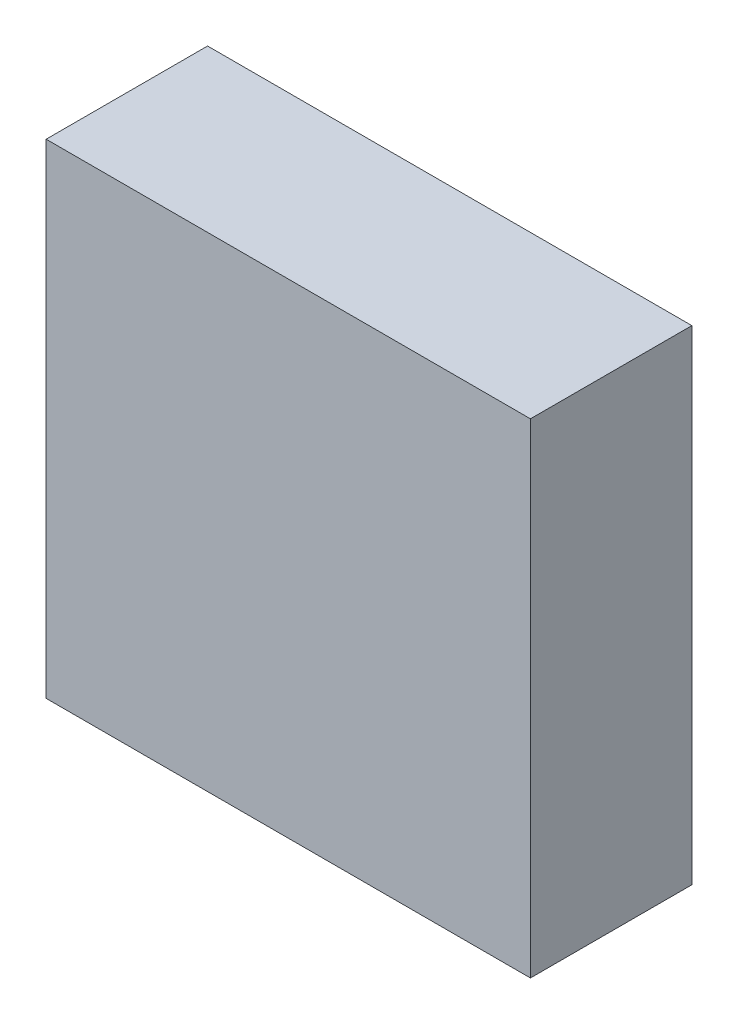
ISO-10303-21;
HEADER;
FILE_DESCRIPTION(('STEP AP214'),'2;1');
FILE_NAME('part.step','',(''),(''),'','','');
FILE_SCHEMA(('AUTOMOTIVE_DESIGN { 1 0 10303 214 1 1 1 1 }'));
ENDSEC;
DATA;
#1=APPLICATION_CONTEXT('core data for automotive mechanical design processes');
#2=APPLICATION_PROTOCOL_DEFINITION('international standard','automotive_design',2000,#1);
#3=PRODUCT_CONTEXT('',#1,'mechanical');
#4=PRODUCT('Part','Part','',(#3));
#5=PRODUCT_RELATED_PRODUCT_CATEGORY('part','',(#4));
#6=PRODUCT_DEFINITION_FORMATION('','',#4);
#7=PRODUCT_DEFINITION_CONTEXT('part definition',#1,'design');
#8=PRODUCT_DEFINITION('design','',#6,#7);
#9=PRODUCT_DEFINITION_SHAPE('','',#8);
#10=(LENGTH_UNIT() NAMED_UNIT(*) SI_UNIT(.MILLI.,.METRE.));
#11=(NAMED_UNIT(*) PLANE_ANGLE_UNIT() SI_UNIT($,.RADIAN.));
#12=(NAMED_UNIT(*) SI_UNIT($,.STERADIAN.) SOLID_ANGLE_UNIT());
#13=UNCERTAINTY_MEASURE_WITH_UNIT(LENGTH_MEASURE(1.E-05),#10,'distance_accuracy_value','');
#14=(GEOMETRIC_REPRESENTATION_CONTEXT(3) GLOBAL_UNCERTAINTY_ASSIGNED_CONTEXT((#13)) GLOBAL_UNIT_ASSIGNED_CONTEXT((#10,
#11,#12)) REPRESENTATION_CONTEXT('',''));
#15=CARTESIAN_POINT('',(0.,0.,0.));
#16=DIRECTION('',(0.,0.,1.));
#17=DIRECTION('',(1.,0.,0.));
#18=AXIS2_PLACEMENT_3D('',#15,#16,#17);
#19=CARTESIAN_POINT('',(4.7625,-4.7625,1.5875));
#20=DIRECTION('',(-1.,0.,0.));
#21=DIRECTION('',(0.,0.,1.));
#22=AXIS2_PLACEMENT_3D('',#19,#20,#21);
#23=PLANE('',#22);
#24=DIRECTION('',(0.,1.,0.));
#25=VECTOR('',#24,1.);
#26=CARTESIAN_POINT('',(4.7625,-4.7625,-1.5875));
#27=LINE('',#26,#25);
#28=CARTESIAN_POINT('',(4.7625,-4.7625,-1.5875));
#29=VERTEX_POINT('',#28);
#30=CARTESIAN_POINT('',(4.7625,4.7625,-1.5875));
#31=VERTEX_POINT('',#30);
#32=EDGE_CURVE('E97',#29,#31,#27,.T.);
#33=ORIENTED_EDGE('',*,*,#32,.T.);
#34=DIRECTION('',(0.,0.,-1.));
#35=VECTOR('',#34,1.);
#36=CARTESIAN_POINT('',(4.7625,4.7625,1.5875));
#37=LINE('',#36,#35);
#38=CARTESIAN_POINT('',(4.7625,4.7625,1.5875));
#39=VERTEX_POINT('',#38);
#40=EDGE_CURVE('E11',#39,#31,#37,.T.);
#41=ORIENTED_EDGE('',*,*,#40,.F.);
#42=DIRECTION('',(0.,1.,0.));
#43=VECTOR('',#42,1.);
#44=CARTESIAN_POINT('',(4.7625,-4.7625,1.5875));
#45=LINE('',#44,#43);
#46=CARTESIAN_POINT('',(4.7625,-4.7625,1.5875));
#47=VERTEX_POINT('',#46);
#48=EDGE_CURVE('E85',#47,#39,#45,.T.);
#49=ORIENTED_EDGE('',*,*,#48,.F.);
#50=DIRECTION('',(0.,0.,-1.));
#51=VECTOR('',#50,1.);
#52=CARTESIAN_POINT('',(4.7625,-4.7625,1.5875));
#53=LINE('',#52,#51);
#54=EDGE_CURVE('E93',#47,#29,#53,.T.);
#55=ORIENTED_EDGE('',*,*,#54,.T.);
#56=EDGE_LOOP('',(#33,#41,#49,#55));
#57=FACE_BOUND('',#56,.T.);
#58=ADVANCED_FACE('F34',(#57),#23,.F.);
#59=CARTESIAN_POINT('',(-4.7625,4.7625,1.5875));
#60=DIRECTION('',(0.,-1.,0.));
#61=DIRECTION('',(0.,0.,-1.));
#62=AXIS2_PLACEMENT_3D('',#59,#60,#61);
#63=PLANE('',#62);
#64=DIRECTION('',(-1.,0.,0.));
#65=VECTOR('',#64,1.);
#66=CARTESIAN_POINT('',(-4.7625,4.7625,-1.5875));
#67=LINE('',#66,#65);
#68=CARTESIAN_POINT('',(-4.7625,4.7625,-1.5875));
#69=VERTEX_POINT('',#68);
#70=EDGE_CURVE('E89',#31,#69,#67,.T.);
#71=ORIENTED_EDGE('',*,*,#70,.T.);
#72=DIRECTION('',(0.,0.,-1.));
#73=VECTOR('',#72,1.);
#74=CARTESIAN_POINT('',(-4.7625,4.7625,1.5875));
#75=LINE('',#74,#73);
#76=CARTESIAN_POINT('',(-4.7625,4.7625,1.5875));
#77=VERTEX_POINT('',#76);
#78=EDGE_CURVE('E42',#77,#69,#75,.T.);
#79=ORIENTED_EDGE('',*,*,#78,.F.);
#80=DIRECTION('',(-1.,0.,0.));
#81=VECTOR('',#80,1.);
#82=CARTESIAN_POINT('',(-4.7625,4.7625,1.5875));
#83=LINE('',#82,#81);
#84=EDGE_CURVE('E80',#39,#77,#83,.T.);
#85=ORIENTED_EDGE('',*,*,#84,.F.);
#86=ORIENTED_EDGE('',*,*,#40,.T.);
#87=EDGE_LOOP('',(#71,#79,#85,#86));
#88=FACE_BOUND('',#87,.T.);
#89=ADVANCED_FACE('F88',(#88),#63,.F.);
#90=CARTESIAN_POINT('',(-4.7625,-4.7625,1.5875));
#91=DIRECTION('',(1.,0.,0.));
#92=DIRECTION('',(0.,0.,-1.));
#93=AXIS2_PLACEMENT_3D('',#90,#91,#92);
#94=PLANE('',#93);
#95=DIRECTION('',(0.,-1.,0.));
#96=VECTOR('',#95,1.);
#97=CARTESIAN_POINT('',(-4.7625,-4.7625,-1.5875));
#98=LINE('',#97,#96);
#99=CARTESIAN_POINT('',(-4.7625,-4.7625,-1.5875));
#100=VERTEX_POINT('',#99);
#101=EDGE_CURVE('E67',#69,#100,#98,.T.);
#102=ORIENTED_EDGE('',*,*,#101,.T.);
#103=DIRECTION('',(0.,0.,-1.));
#104=VECTOR('',#103,1.);
#105=CARTESIAN_POINT('',(-4.7625,-4.7625,1.5875));
#106=LINE('',#105,#104);
#107=CARTESIAN_POINT('',(-4.7625,-4.7625,1.5875));
#108=VERTEX_POINT('',#107);
#109=EDGE_CURVE('E90',#108,#100,#106,.T.);
#110=ORIENTED_EDGE('',*,*,#109,.F.);
#111=DIRECTION('',(0.,-1.,0.));
#112=VECTOR('',#111,1.);
#113=CARTESIAN_POINT('',(-4.7625,-4.7625,1.5875));
#114=LINE('',#113,#112);
#115=EDGE_CURVE('E83',#77,#108,#114,.T.);
#116=ORIENTED_EDGE('',*,*,#115,.F.);
#117=ORIENTED_EDGE('',*,*,#78,.T.);
#118=EDGE_LOOP('',(#102,#110,#116,#117));
#119=FACE_BOUND('',#118,.T.);
#120=ADVANCED_FACE('F91',(#119),#94,.F.);
#121=CARTESIAN_POINT('',(-4.7625,-4.7625,1.5875));
#122=DIRECTION('',(0.,1.,0.));
#123=DIRECTION('',(0.,0.,1.));
#124=AXIS2_PLACEMENT_3D('',#121,#122,#123);
#125=PLANE('',#124);
#126=DIRECTION('',(1.,0.,0.));
#127=VECTOR('',#126,1.);
#128=CARTESIAN_POINT('',(-4.7625,-4.7625,-1.5875));
#129=LINE('',#128,#127);
#130=EDGE_CURVE('E73',#100,#29,#129,.T.);
#131=ORIENTED_EDGE('',*,*,#130,.T.);
#132=ORIENTED_EDGE('',*,*,#54,.F.);
#133=DIRECTION('',(1.,0.,0.));
#134=VECTOR('',#133,1.);
#135=CARTESIAN_POINT('',(-4.7625,-4.7625,1.5875));
#136=LINE('',#135,#134);
#137=EDGE_CURVE('E50',#108,#47,#136,.T.);
#138=ORIENTED_EDGE('',*,*,#137,.F.);
#139=ORIENTED_EDGE('',*,*,#109,.T.);
#140=EDGE_LOOP('',(#131,#132,#138,#139));
#141=FACE_BOUND('',#140,.T.);
#142=ADVANCED_FACE('F104',(#141),#125,.F.);
#143=CARTESIAN_POINT('',(0.,0.,1.5875));
#144=DIRECTION('',(0.,0.,-1.));
#145=DIRECTION('',(-1.,0.,0.));
#146=AXIS2_PLACEMENT_3D('',#143,#144,#145);
#147=PLANE('',#146);
#148=ORIENTED_EDGE('',*,*,#48,.T.);
#149=ORIENTED_EDGE('',*,*,#84,.T.);
#150=ORIENTED_EDGE('',*,*,#115,.T.);
#151=ORIENTED_EDGE('',*,*,#137,.T.);
#152=EDGE_LOOP('',(#148,#149,#150,#151));
#153=FACE_BOUND('',#152,.T.);
#154=ADVANCED_FACE('F81',(#153),#147,.F.);
#155=CARTESIAN_POINT('',(0.,0.,-1.5875));
#156=DIRECTION('',(0.,0.,-1.));
#157=DIRECTION('',(-1.,0.,0.));
#158=AXIS2_PLACEMENT_3D('',#155,#156,#157);
#159=PLANE('',#158);
#160=ORIENTED_EDGE('',*,*,#32,.F.);
#161=ORIENTED_EDGE('',*,*,#130,.F.);
#162=ORIENTED_EDGE('',*,*,#101,.F.);
#163=ORIENTED_EDGE('',*,*,#70,.F.);
#164=EDGE_LOOP('',(#160,#161,#162,#163));
#165=FACE_BOUND('',#164,.T.);
#166=ADVANCED_FACE('F107',(#165),#159,.T.);
#167=CLOSED_SHELL('',(#58,#89,#120,#142,#154,#166));
#168=MANIFOLD_SOLID_BREP('B2',#167);
#169=ADVANCED_BREP_SHAPE_REPRESENTATION('',(#18,#168),#14);
#170=SHAPE_DEFINITION_REPRESENTATION(#9,#169);
ENDSEC;
END-ISO-10303-21;
